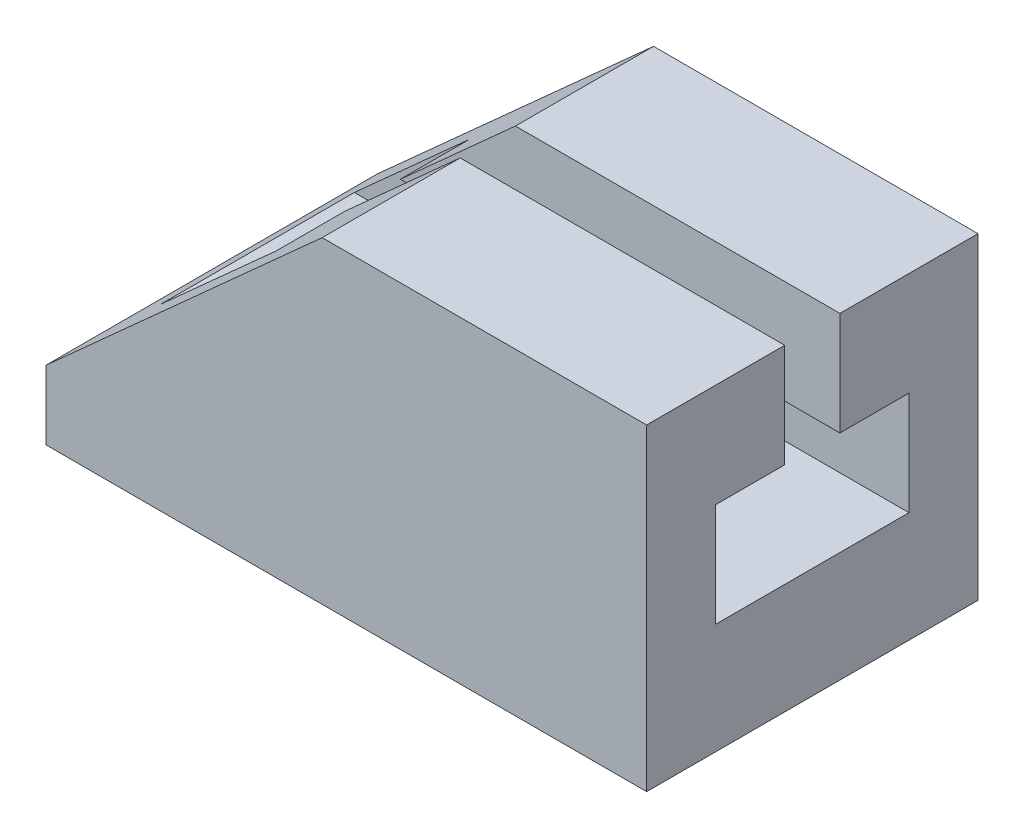
ISO-10303-21;
HEADER;
FILE_DESCRIPTION(('STEP AP214'),'2;1');
FILE_NAME('part.step','',(''),(''),'','','');
FILE_SCHEMA(('AUTOMOTIVE_DESIGN { 1 0 10303 214 1 1 1 1 }'));
ENDSEC;
DATA;
#1=APPLICATION_CONTEXT('core data for automotive mechanical design processes');
#2=APPLICATION_PROTOCOL_DEFINITION('international standard','automotive_design',2000,#1);
#3=PRODUCT_CONTEXT('',#1,'mechanical');
#4=PRODUCT('Part','Part','',(#3));
#5=PRODUCT_RELATED_PRODUCT_CATEGORY('part','',(#4));
#6=PRODUCT_DEFINITION_FORMATION('','',#4);
#7=PRODUCT_DEFINITION_CONTEXT('part definition',#1,'design');
#8=PRODUCT_DEFINITION('design','',#6,#7);
#9=PRODUCT_DEFINITION_SHAPE('','',#8);
#10=(LENGTH_UNIT() NAMED_UNIT(*) SI_UNIT(.MILLI.,.METRE.));
#11=(NAMED_UNIT(*) PLANE_ANGLE_UNIT() SI_UNIT($,.RADIAN.));
#12=(NAMED_UNIT(*) SI_UNIT($,.STERADIAN.) SOLID_ANGLE_UNIT());
#13=UNCERTAINTY_MEASURE_WITH_UNIT(LENGTH_MEASURE(1.E-05),#10,'distance_accuracy_value','');
#14=(GEOMETRIC_REPRESENTATION_CONTEXT(3) GLOBAL_UNCERTAINTY_ASSIGNED_CONTEXT((#13)) GLOBAL_UNIT_ASSIGNED_CONTEXT((#10,
#11,#12)) REPRESENTATION_CONTEXT('',''));
#15=CARTESIAN_POINT('',(0.,0.,0.));
#16=DIRECTION('',(0.,0.,1.));
#17=DIRECTION('',(1.,0.,0.));
#18=AXIS2_PLACEMENT_3D('',#15,#16,#17);
#19=CARTESIAN_POINT('',(0.,46.,48.));
#20=DIRECTION('',(0.,-1.,0.));
#21=DIRECTION('',(1.,0.,0.));
#22=AXIS2_PLACEMENT_3D('',#19,#20,#21);
#23=PLANE('',#22);
#24=DIRECTION('',(0.,0.,-1.));
#25=VECTOR('',#24,1.);
#26=CARTESIAN_POINT('',(0.,46.,48.));
#27=LINE('',#26,#25);
#28=CARTESIAN_POINT('',(0.,46.,48.));
#29=VERTEX_POINT('',#28);
#30=CARTESIAN_POINT('',(0.,46.,28.));
#31=VERTEX_POINT('',#30);
#32=EDGE_CURVE('E136',#29,#31,#27,.T.);
#33=ORIENTED_EDGE('',*,*,#32,.T.);
#34=DIRECTION('',(1.,0.,0.));
#35=VECTOR('',#34,1.);
#36=CARTESIAN_POINT('',(-87.,46.,28.));
#37=LINE('',#36,#35);
#38=CARTESIAN_POINT('',(-47.,46.,28.));
#39=VERTEX_POINT('',#38);
#40=EDGE_CURVE('E109',#39,#31,#37,.T.);
#41=ORIENTED_EDGE('',*,*,#40,.F.);
#42=DIRECTION('',(0.,0.,-1.));
#43=VECTOR('',#42,1.);
#44=CARTESIAN_POINT('',(-47.,46.,48.));
#45=LINE('',#44,#43);
#46=CARTESIAN_POINT('',(-47.,46.,48.));
#47=VERTEX_POINT('',#46);
#48=EDGE_CURVE('E107',#47,#39,#45,.T.);
#49=ORIENTED_EDGE('',*,*,#48,.F.);
#50=DIRECTION('',(-1.,0.,0.));
#51=VECTOR('',#50,1.);
#52=CARTESIAN_POINT('',(0.,46.,48.));
#53=LINE('',#52,#51);
#54=EDGE_CURVE('E96',#29,#47,#53,.T.);
#55=ORIENTED_EDGE('',*,*,#54,.F.);
#56=EDGE_LOOP('',(#33,#41,#49,#55));
#57=FACE_BOUND('',#56,.T.);
#58=ADVANCED_FACE('F33',(#57),#23,.F.);
#59=CARTESIAN_POINT('',(-87.,0.,48.));
#60=DIRECTION('',(0.,1.,0.));
#61=DIRECTION('',(0.,0.,1.));
#62=AXIS2_PLACEMENT_3D('',#59,#60,#61);
#63=PLANE('',#62);
#64=DIRECTION('',(1.,0.,0.));
#65=VECTOR('',#64,1.);
#66=CARTESIAN_POINT('',(-87.,0.,0.));
#67=LINE('',#66,#65);
#68=CARTESIAN_POINT('',(-87.,0.,0.));
#69=VERTEX_POINT('',#68);
#70=CARTESIAN_POINT('',(0.,0.,0.));
#71=VERTEX_POINT('',#70);
#72=EDGE_CURVE('E121',#69,#71,#67,.T.);
#73=ORIENTED_EDGE('',*,*,#72,.T.);
#74=DIRECTION('',(0.,0.,-1.));
#75=VECTOR('',#74,1.);
#76=CARTESIAN_POINT('',(0.,0.,48.));
#77=LINE('',#76,#75);
#78=CARTESIAN_POINT('',(0.,0.,48.));
#79=VERTEX_POINT('',#78);
#80=EDGE_CURVE('E138',#79,#71,#77,.T.);
#81=ORIENTED_EDGE('',*,*,#80,.F.);
#82=DIRECTION('',(1.,0.,0.));
#83=VECTOR('',#82,1.);
#84=CARTESIAN_POINT('',(-87.,0.,48.));
#85=LINE('',#84,#83);
#86=CARTESIAN_POINT('',(-87.,0.,48.));
#87=VERTEX_POINT('',#86);
#88=EDGE_CURVE('E133',#87,#79,#85,.T.);
#89=ORIENTED_EDGE('',*,*,#88,.F.);
#90=DIRECTION('',(0.,0.,-1.));
#91=VECTOR('',#90,1.);
#92=CARTESIAN_POINT('',(-87.,0.,48.));
#93=LINE('',#92,#91);
#94=EDGE_CURVE('E117',#87,#69,#93,.T.);
#95=ORIENTED_EDGE('',*,*,#94,.T.);
#96=EDGE_LOOP('',(#73,#81,#89,#95));
#97=FACE_BOUND('',#96,.T.);
#98=ADVANCED_FACE('F35',(#97),#63,.F.);
#99=CARTESIAN_POINT('',(0.,0.,48.));
#100=DIRECTION('',(-1.,0.,0.));
#101=DIRECTION('',(0.,0.,1.));
#102=AXIS2_PLACEMENT_3D('',#99,#100,#101);
#103=PLANE('',#102);
#104=DIRECTION('',(0.,0.,1.));
#105=VECTOR('',#104,1.);
#106=CARTESIAN_POINT('',(0.,31.,38.));
#107=LINE('',#106,#105);
#108=CARTESIAN_POINT('',(0.,31.,28.));
#109=VERTEX_POINT('',#108);
#110=CARTESIAN_POINT('',(0.,31.,38.));
#111=VERTEX_POINT('',#110);
#112=EDGE_CURVE('E213',#109,#111,#107,.T.);
#113=ORIENTED_EDGE('',*,*,#112,.F.);
#114=DIRECTION('',(0.,-1.,0.));
#115=VECTOR('',#114,1.);
#116=CARTESIAN_POINT('',(0.,46.,28.));
#117=LINE('',#116,#115);
#118=EDGE_CURVE('E215',#31,#109,#117,.T.);
#119=ORIENTED_EDGE('',*,*,#118,.F.);
#120=ORIENTED_EDGE('',*,*,#32,.F.);
#121=DIRECTION('',(0.,1.,0.));
#122=VECTOR('',#121,1.);
#123=CARTESIAN_POINT('',(0.,0.,48.));
#124=LINE('',#123,#122);
#125=EDGE_CURVE('E90',#79,#29,#124,.T.);
#126=ORIENTED_EDGE('',*,*,#125,.F.);
#127=ORIENTED_EDGE('',*,*,#80,.T.);
#128=DIRECTION('',(0.,1.,0.));
#129=VECTOR('',#128,1.);
#130=CARTESIAN_POINT('',(0.,0.,0.));
#131=LINE('',#130,#129);
#132=CARTESIAN_POINT('',(0.,46.,0.));
#133=VERTEX_POINT('',#132);
#134=EDGE_CURVE('E124',#71,#133,#131,.T.);
#135=ORIENTED_EDGE('',*,*,#134,.T.);
#136=CARTESIAN_POINT('',(0.,46.,20.));
#137=VERTEX_POINT('',#136);
#138=EDGE_CURVE('E111',#137,#133,#27,.T.);
#139=ORIENTED_EDGE('',*,*,#138,.F.);
#140=DIRECTION('',(0.,1.,0.));
#141=VECTOR('',#140,1.);
#142=CARTESIAN_POINT('',(0.,46.,20.));
#143=LINE('',#142,#141);
#144=CARTESIAN_POINT('',(0.,31.,20.));
#145=VERTEX_POINT('',#144);
#146=EDGE_CURVE('E184',#145,#137,#143,.T.);
#147=ORIENTED_EDGE('',*,*,#146,.F.);
#148=DIRECTION('',(0.,0.,1.));
#149=VECTOR('',#148,1.);
#150=CARTESIAN_POINT('',(0.,31.,10.));
#151=LINE('',#150,#149);
#152=CARTESIAN_POINT('',(0.,31.,10.));
#153=VERTEX_POINT('',#152);
#154=EDGE_CURVE('E201',#153,#145,#151,.T.);
#155=ORIENTED_EDGE('',*,*,#154,.F.);
#156=DIRECTION('',(0.,1.,0.));
#157=VECTOR('',#156,1.);
#158=CARTESIAN_POINT('',(0.,31.,10.));
#159=LINE('',#158,#157);
#160=CARTESIAN_POINT('',(0.,16.,10.));
#161=VERTEX_POINT('',#160);
#162=EDGE_CURVE('E204',#161,#153,#159,.T.);
#163=ORIENTED_EDGE('',*,*,#162,.F.);
#164=DIRECTION('',(0.,0.,-1.));
#165=VECTOR('',#164,1.);
#166=CARTESIAN_POINT('',(0.,16.,38.));
#167=LINE('',#166,#165);
#168=CARTESIAN_POINT('',(0.,16.,38.));
#169=VERTEX_POINT('',#168);
#170=EDGE_CURVE('E207',#169,#161,#167,.T.);
#171=ORIENTED_EDGE('',*,*,#170,.F.);
#172=DIRECTION('',(0.,-1.,0.));
#173=VECTOR('',#172,1.);
#174=CARTESIAN_POINT('',(0.,31.,38.));
#175=LINE('',#174,#173);
#176=EDGE_CURVE('E210',#111,#169,#175,.T.);
#177=ORIENTED_EDGE('',*,*,#176,.F.);
#178=EDGE_LOOP('',(#113,#119,#120,#126,#127,#135,#139,#147,#155,#163,#171,#177));
#179=FACE_BOUND('',#178,.T.);
#180=ADVANCED_FACE('F229',(#179),#103,.F.);
#181=CARTESIAN_POINT('',(-47.,46.,20.));
#182=VERTEX_POINT('',#181);
#183=CARTESIAN_POINT('',(-47.,46.,0.));
#184=VERTEX_POINT('',#183);
#185=EDGE_CURVE('E112',#182,#184,#45,.T.);
#186=ORIENTED_EDGE('',*,*,#185,.F.);
#187=DIRECTION('',(1.,0.,0.));
#188=VECTOR('',#187,1.);
#189=CARTESIAN_POINT('',(-87.,46.,20.));
#190=LINE('',#189,#188);
#191=EDGE_CURVE('E168',#182,#137,#190,.T.);
#192=ORIENTED_EDGE('',*,*,#191,.T.);
#193=ORIENTED_EDGE('',*,*,#138,.T.);
#194=DIRECTION('',(-1.,0.,0.));
#195=VECTOR('',#194,1.);
#196=CARTESIAN_POINT('',(0.,46.,0.));
#197=LINE('',#196,#195);
#198=EDGE_CURVE('E127',#133,#184,#197,.T.);
#199=ORIENTED_EDGE('',*,*,#198,.T.);
#200=EDGE_LOOP('',(#186,#192,#193,#199));
#201=FACE_BOUND('',#200,.T.);
#202=ADVANCED_FACE('F166',(#201),#23,.F.);
#203=CARTESIAN_POINT('',(-47.,46.,48.));
#204=DIRECTION('',(0.66896473162245,-0.743294146247166,0.));
#205=DIRECTION('',(0.743294146247166,0.66896473162245,0.));
#206=AXIS2_PLACEMENT_3D('',#203,#204,#205);
#207=PLANE('',#206);
#208=ORIENTED_EDGE('',*,*,#48,.T.);
#209=DIRECTION('',(-0.743294146247166,-0.66896473162245,0.));
#210=VECTOR('',#209,1.);
#211=CARTESIAN_POINT('',(-47.,46.,28.));
#212=LINE('',#211,#210);
#213=CARTESIAN_POINT('',(-63.6666666666667,31.,28.));
#214=VERTEX_POINT('',#213);
#215=EDGE_CURVE('E11',#39,#214,#212,.T.);
#216=ORIENTED_EDGE('',*,*,#215,.T.);
#217=DIRECTION('',(0.,0.,1.));
#218=VECTOR('',#217,1.);
#219=CARTESIAN_POINT('',(-63.6666666666667,31.,48.));
#220=LINE('',#219,#218);
#221=CARTESIAN_POINT('',(-63.6666666666667,31.,38.));
#222=VERTEX_POINT('',#221);
#223=EDGE_CURVE('E140',#214,#222,#220,.T.);
#224=ORIENTED_EDGE('',*,*,#223,.T.);
#225=DIRECTION('',(-0.743294146247166,-0.66896473162245,0.));
#226=VECTOR('',#225,1.);
#227=CARTESIAN_POINT('',(-47.,46.,38.));
#228=LINE('',#227,#226);
#229=CARTESIAN_POINT('',(-80.3333333333334,16.,38.));
#230=VERTEX_POINT('',#229);
#231=EDGE_CURVE('E143',#222,#230,#228,.T.);
#232=ORIENTED_EDGE('',*,*,#231,.T.);
#233=DIRECTION('',(0.,0.,-1.));
#234=VECTOR('',#233,1.);
#235=CARTESIAN_POINT('',(-80.3333333333333,16.,48.));
#236=LINE('',#235,#234);
#237=CARTESIAN_POINT('',(-80.3333333333333,16.,10.));
#238=VERTEX_POINT('',#237);
#239=EDGE_CURVE('E146',#230,#238,#236,.T.);
#240=ORIENTED_EDGE('',*,*,#239,.T.);
#241=DIRECTION('',(0.743294146247166,0.66896473162245,0.));
#242=VECTOR('',#241,1.);
#243=CARTESIAN_POINT('',(-47.,46.,10.));
#244=LINE('',#243,#242);
#245=CARTESIAN_POINT('',(-63.6666666666667,31.,10.));
#246=VERTEX_POINT('',#245);
#247=EDGE_CURVE('E149',#238,#246,#244,.T.);
#248=ORIENTED_EDGE('',*,*,#247,.T.);
#249=DIRECTION('',(0.,0.,1.));
#250=VECTOR('',#249,1.);
#251=CARTESIAN_POINT('',(-63.6666666666667,31.,48.));
#252=LINE('',#251,#250);
#253=CARTESIAN_POINT('',(-63.6666666666667,31.,20.));
#254=VERTEX_POINT('',#253);
#255=EDGE_CURVE('E152',#246,#254,#252,.T.);
#256=ORIENTED_EDGE('',*,*,#255,.T.);
#257=DIRECTION('',(0.743294146247166,0.66896473162245,0.));
#258=VECTOR('',#257,1.);
#259=CARTESIAN_POINT('',(-47.,46.,20.));
#260=LINE('',#259,#258);
#261=EDGE_CURVE('E41',#254,#182,#260,.T.);
#262=ORIENTED_EDGE('',*,*,#261,.T.);
#263=ORIENTED_EDGE('',*,*,#185,.T.);
#264=DIRECTION('',(-0.743294146247166,-0.66896473162245,0.));
#265=VECTOR('',#264,1.);
#266=CARTESIAN_POINT('',(-47.,46.,0.));
#267=LINE('',#266,#265);
#268=CARTESIAN_POINT('',(-87.,10.,0.));
#269=VERTEX_POINT('',#268);
#270=EDGE_CURVE('E130',#184,#269,#267,.T.);
#271=ORIENTED_EDGE('',*,*,#270,.T.);
#272=DIRECTION('',(0.,0.,-1.));
#273=VECTOR('',#272,1.);
#274=CARTESIAN_POINT('',(-87.,10.,48.));
#275=LINE('',#274,#273);
#276=CARTESIAN_POINT('',(-87.,10.,48.));
#277=VERTEX_POINT('',#276);
#278=EDGE_CURVE('E115',#277,#269,#275,.T.);
#279=ORIENTED_EDGE('',*,*,#278,.F.);
#280=DIRECTION('',(-0.743294146247166,-0.66896473162245,0.));
#281=VECTOR('',#280,1.);
#282=CARTESIAN_POINT('',(-47.,46.,48.));
#283=LINE('',#282,#281);
#284=EDGE_CURVE('E100',#47,#277,#283,.T.);
#285=ORIENTED_EDGE('',*,*,#284,.F.);
#286=EDGE_LOOP('',(#208,#216,#224,#232,#240,#248,#256,#262,#263,#271,#279,#285));
#287=FACE_BOUND('',#286,.T.);
#288=ADVANCED_FACE('F114',(#287),#207,.F.);
#289=CARTESIAN_POINT('',(-87.,10.,48.));
#290=DIRECTION('',(1.,0.,0.));
#291=DIRECTION('',(0.,0.,-1.));
#292=AXIS2_PLACEMENT_3D('',#289,#290,#291);
#293=PLANE('',#292);
#294=DIRECTION('',(0.,-1.,0.));
#295=VECTOR('',#294,1.);
#296=CARTESIAN_POINT('',(-87.,10.,0.));
#297=LINE('',#296,#295);
#298=EDGE_CURVE('E81',#269,#69,#297,.T.);
#299=ORIENTED_EDGE('',*,*,#298,.T.);
#300=ORIENTED_EDGE('',*,*,#94,.F.);
#301=DIRECTION('',(0.,-1.,0.));
#302=VECTOR('',#301,1.);
#303=CARTESIAN_POINT('',(-87.,10.,48.));
#304=LINE('',#303,#302);
#305=EDGE_CURVE('E57',#277,#87,#304,.T.);
#306=ORIENTED_EDGE('',*,*,#305,.F.);
#307=ORIENTED_EDGE('',*,*,#278,.T.);
#308=EDGE_LOOP('',(#299,#300,#306,#307));
#309=FACE_BOUND('',#308,.T.);
#310=ADVANCED_FACE('F175',(#309),#293,.F.);
#311=CARTESIAN_POINT('',(0.,0.,48.));
#312=DIRECTION('',(0.,0.,1.));
#313=DIRECTION('',(1.,0.,0.));
#314=AXIS2_PLACEMENT_3D('',#311,#312,#313);
#315=PLANE('',#314);
#316=ORIENTED_EDGE('',*,*,#88,.T.);
#317=ORIENTED_EDGE('',*,*,#125,.T.);
#318=ORIENTED_EDGE('',*,*,#54,.T.);
#319=ORIENTED_EDGE('',*,*,#284,.T.);
#320=ORIENTED_EDGE('',*,*,#305,.T.);
#321=EDGE_LOOP('',(#316,#317,#318,#319,#320));
#322=FACE_BOUND('',#321,.T.);
#323=ADVANCED_FACE('F98',(#322),#315,.T.);
#324=CARTESIAN_POINT('',(0.,0.,0.));
#325=DIRECTION('',(0.,0.,1.));
#326=DIRECTION('',(1.,0.,0.));
#327=AXIS2_PLACEMENT_3D('',#324,#325,#326);
#328=PLANE('',#327);
#329=ORIENTED_EDGE('',*,*,#72,.F.);
#330=ORIENTED_EDGE('',*,*,#298,.F.);
#331=ORIENTED_EDGE('',*,*,#270,.F.);
#332=ORIENTED_EDGE('',*,*,#198,.F.);
#333=ORIENTED_EDGE('',*,*,#134,.F.);
#334=EDGE_LOOP('',(#329,#330,#331,#332,#333));
#335=FACE_BOUND('',#334,.T.);
#336=ADVANCED_FACE('F174',(#335),#328,.F.);
#337=CARTESIAN_POINT('',(-87.,46.,28.));
#338=DIRECTION('',(0.,0.,1.));
#339=DIRECTION('',(0.,-1.,0.));
#340=AXIS2_PLACEMENT_3D('',#337,#338,#339);
#341=PLANE('',#340);
#342=ORIENTED_EDGE('',*,*,#40,.T.);
#343=ORIENTED_EDGE('',*,*,#118,.T.);
#344=DIRECTION('',(1.,0.,0.));
#345=VECTOR('',#344,1.);
#346=CARTESIAN_POINT('',(-87.,31.,28.));
#347=LINE('',#346,#345);
#348=EDGE_CURVE('E181',#214,#109,#347,.T.);
#349=ORIENTED_EDGE('',*,*,#348,.F.);
#350=ORIENTED_EDGE('',*,*,#215,.F.);
#351=EDGE_LOOP('',(#342,#343,#349,#350));
#352=FACE_BOUND('',#351,.T.);
#353=ADVANCED_FACE('F222',(#352),#341,.F.);
#354=CARTESIAN_POINT('',(-87.,46.,20.));
#355=DIRECTION('',(0.,0.,-1.));
#356=DIRECTION('',(-1.,0.,0.));
#357=AXIS2_PLACEMENT_3D('',#354,#355,#356);
#358=PLANE('',#357);
#359=DIRECTION('',(1.,0.,0.));
#360=VECTOR('',#359,1.);
#361=CARTESIAN_POINT('',(-87.,31.,20.));
#362=LINE('',#361,#360);
#363=EDGE_CURVE('E195',#254,#145,#362,.T.);
#364=ORIENTED_EDGE('',*,*,#363,.T.);
#365=ORIENTED_EDGE('',*,*,#146,.T.);
#366=ORIENTED_EDGE('',*,*,#191,.F.);
#367=ORIENTED_EDGE('',*,*,#261,.F.);
#368=EDGE_LOOP('',(#364,#365,#366,#367));
#369=FACE_BOUND('',#368,.T.);
#370=ADVANCED_FACE('F267',(#369),#358,.F.);
#371=CARTESIAN_POINT('',(-87.,31.,10.));
#372=DIRECTION('',(0.,1.,0.));
#373=DIRECTION('',(0.,0.,1.));
#374=AXIS2_PLACEMENT_3D('',#371,#372,#373);
#375=PLANE('',#374);
#376=DIRECTION('',(1.,0.,0.));
#377=VECTOR('',#376,1.);
#378=CARTESIAN_POINT('',(-87.,31.,10.));
#379=LINE('',#378,#377);
#380=EDGE_CURVE('E192',#246,#153,#379,.T.);
#381=ORIENTED_EDGE('',*,*,#380,.T.);
#382=ORIENTED_EDGE('',*,*,#154,.T.);
#383=ORIENTED_EDGE('',*,*,#363,.F.);
#384=ORIENTED_EDGE('',*,*,#255,.F.);
#385=EDGE_LOOP('',(#381,#382,#383,#384));
#386=FACE_BOUND('',#385,.T.);
#387=ADVANCED_FACE('F256',(#386),#375,.F.);
#388=CARTESIAN_POINT('',(-87.,31.,10.));
#389=DIRECTION('',(0.,0.,-1.));
#390=DIRECTION('',(0.,1.,0.));
#391=AXIS2_PLACEMENT_3D('',#388,#389,#390);
#392=PLANE('',#391);
#393=DIRECTION('',(1.,0.,0.));
#394=VECTOR('',#393,1.);
#395=CARTESIAN_POINT('',(-87.,16.,10.));
#396=LINE('',#395,#394);
#397=EDGE_CURVE('E189',#238,#161,#396,.T.);
#398=ORIENTED_EDGE('',*,*,#397,.T.);
#399=ORIENTED_EDGE('',*,*,#162,.T.);
#400=ORIENTED_EDGE('',*,*,#380,.F.);
#401=ORIENTED_EDGE('',*,*,#247,.F.);
#402=EDGE_LOOP('',(#398,#399,#400,#401));
#403=FACE_BOUND('',#402,.T.);
#404=ADVANCED_FACE('F258',(#403),#392,.F.);
#405=CARTESIAN_POINT('',(-87.,16.,38.));
#406=DIRECTION('',(0.,-1.,0.));
#407=DIRECTION('',(0.,0.,-1.));
#408=AXIS2_PLACEMENT_3D('',#405,#406,#407);
#409=PLANE('',#408);
#410=DIRECTION('',(1.,0.,0.));
#411=VECTOR('',#410,1.);
#412=CARTESIAN_POINT('',(-87.,16.,38.));
#413=LINE('',#412,#411);
#414=EDGE_CURVE('E186',#230,#169,#413,.T.);
#415=ORIENTED_EDGE('',*,*,#414,.T.);
#416=ORIENTED_EDGE('',*,*,#170,.T.);
#417=ORIENTED_EDGE('',*,*,#397,.F.);
#418=ORIENTED_EDGE('',*,*,#239,.F.);
#419=EDGE_LOOP('',(#415,#416,#417,#418));
#420=FACE_BOUND('',#419,.T.);
#421=ADVANCED_FACE('F264',(#420),#409,.F.);
#422=CARTESIAN_POINT('',(-87.,31.,38.));
#423=DIRECTION('',(0.,0.,1.));
#424=DIRECTION('',(1.,0.,0.));
#425=AXIS2_PLACEMENT_3D('',#422,#423,#424);
#426=PLANE('',#425);
#427=DIRECTION('',(1.,0.,0.));
#428=VECTOR('',#427,1.);
#429=CARTESIAN_POINT('',(-87.,31.,38.));
#430=LINE('',#429,#428);
#431=EDGE_CURVE('E48',#222,#111,#430,.T.);
#432=ORIENTED_EDGE('',*,*,#431,.T.);
#433=ORIENTED_EDGE('',*,*,#176,.T.);
#434=ORIENTED_EDGE('',*,*,#414,.F.);
#435=ORIENTED_EDGE('',*,*,#231,.F.);
#436=EDGE_LOOP('',(#432,#433,#434,#435));
#437=FACE_BOUND('',#436,.T.);
#438=ADVANCED_FACE('F265',(#437),#426,.F.);
#439=CARTESIAN_POINT('',(-87.,31.,38.));
#440=DIRECTION('',(0.,1.,0.));
#441=DIRECTION('',(0.,0.,1.));
#442=AXIS2_PLACEMENT_3D('',#439,#440,#441);
#443=PLANE('',#442);
#444=ORIENTED_EDGE('',*,*,#348,.T.);
#445=ORIENTED_EDGE('',*,*,#112,.T.);
#446=ORIENTED_EDGE('',*,*,#431,.F.);
#447=ORIENTED_EDGE('',*,*,#223,.F.);
#448=EDGE_LOOP('',(#444,#445,#446,#447));
#449=FACE_BOUND('',#448,.T.);
#450=ADVANCED_FACE('F231',(#449),#443,.F.);
#451=CLOSED_SHELL('',(#58,#98,#180,#202,#288,#310,#323,#336,#353,#370,#387,#404,#421,#438,#450));
#452=MANIFOLD_SOLID_BREP('B2',#451);
#453=ADVANCED_BREP_SHAPE_REPRESENTATION('',(#18,#452),#14);
#454=SHAPE_DEFINITION_REPRESENTATION(#9,#453);
ENDSEC;
END-ISO-10303-21;
